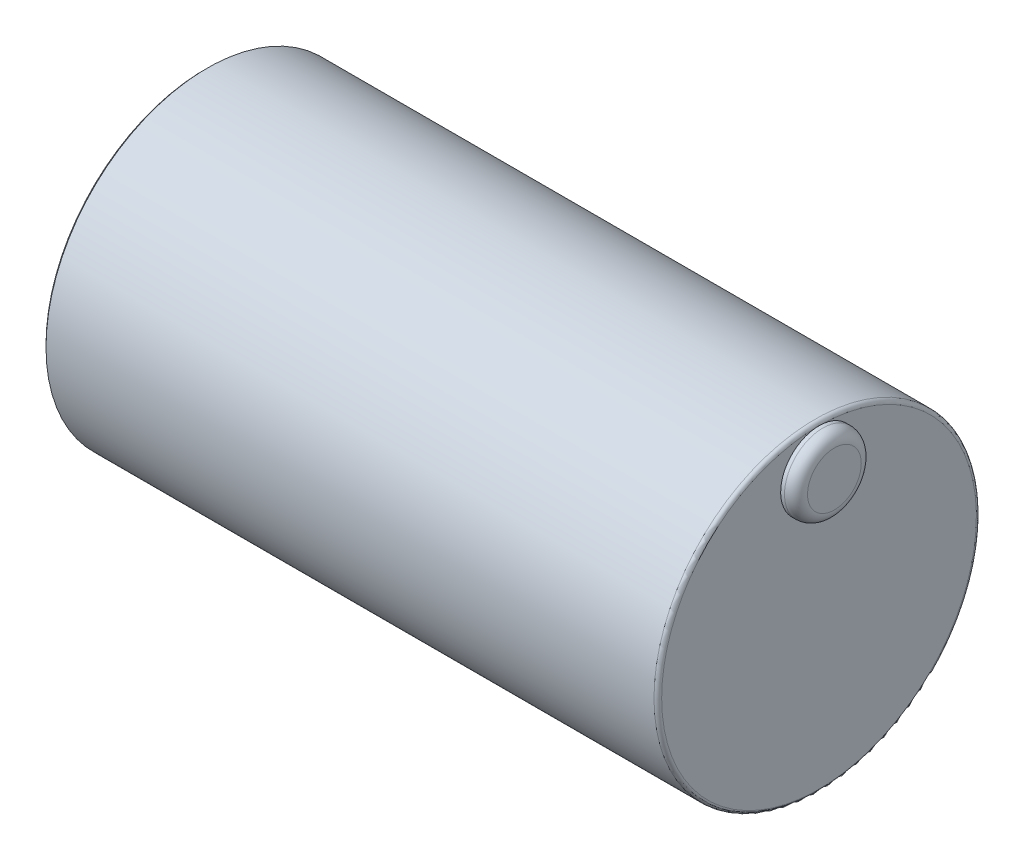
ISO-10303-21;
HEADER;
FILE_DESCRIPTION(('STEP AP214'),'2;1');
FILE_NAME('part.step','',(''),(''),'','','');
FILE_SCHEMA(('AUTOMOTIVE_DESIGN { 1 0 10303 214 1 1 1 1 }'));
ENDSEC;
DATA;
#1=APPLICATION_CONTEXT('core data for automotive mechanical design processes');
#2=APPLICATION_PROTOCOL_DEFINITION('international standard','automotive_design',2000,#1);
#3=PRODUCT_CONTEXT('',#1,'mechanical');
#4=PRODUCT('Part','Part','',(#3));
#5=PRODUCT_RELATED_PRODUCT_CATEGORY('part','',(#4));
#6=PRODUCT_DEFINITION_FORMATION('','',#4);
#7=PRODUCT_DEFINITION_CONTEXT('part definition',#1,'design');
#8=PRODUCT_DEFINITION('design','',#6,#7);
#9=PRODUCT_DEFINITION_SHAPE('','',#8);
#10=(LENGTH_UNIT() NAMED_UNIT(*) SI_UNIT(.MILLI.,.METRE.));
#11=(NAMED_UNIT(*) PLANE_ANGLE_UNIT() SI_UNIT($,.RADIAN.));
#12=(NAMED_UNIT(*) SI_UNIT($,.STERADIAN.) SOLID_ANGLE_UNIT());
#13=UNCERTAINTY_MEASURE_WITH_UNIT(LENGTH_MEASURE(1.E-05),#10,'distance_accuracy_value','');
#14=(GEOMETRIC_REPRESENTATION_CONTEXT(3) GLOBAL_UNCERTAINTY_ASSIGNED_CONTEXT((#13)) GLOBAL_UNIT_ASSIGNED_CONTEXT((#10,
#11,#12)) REPRESENTATION_CONTEXT('',''));
#15=CARTESIAN_POINT('',(0.,0.,0.));
#16=DIRECTION('',(0.,0.,1.));
#17=DIRECTION('',(1.,0.,0.));
#18=AXIS2_PLACEMENT_3D('',#15,#16,#17);
#19=CARTESIAN_POINT('',(0.,0.,0.));
#20=DIRECTION('',(1.,0.,0.));
#21=DIRECTION('',(0.,0.,-1.));
#22=AXIS2_PLACEMENT_3D('',#19,#20,#21);
#23=PLANE('',#22);
#24=CARTESIAN_POINT('',(0.,0.,0.));
#25=DIRECTION('',(1.,0.,0.));
#26=DIRECTION('',(0.,0.,-1.));
#27=AXIS2_PLACEMENT_3D('',#24,#25,#26);
#28=CIRCLE('',#27,10.7);
#29=CARTESIAN_POINT('',(0.,0.,-10.7));
#30=VERTEX_POINT('',#29);
#31=EDGE_CURVE('E116',#30,#30,#28,.F.);
#32=ORIENTED_EDGE('',*,*,#31,.T.);
#33=EDGE_LOOP('',(#32));
#34=FACE_BOUND('',#33,.T.);
#35=ADVANCED_FACE('F40',(#34),#23,.F.);
#36=CARTESIAN_POINT('',(-33.7551020408164,0.,0.));
#37=DIRECTION('',(-1.,0.,0.));
#38=DIRECTION('',(0.,0.,1.));
#39=AXIS2_PLACEMENT_3D('',#36,#37,#38);
#40=CYLINDRICAL_SURFACE('',#39,11.);
#41=CARTESIAN_POINT('',(0.300000000000016,0.,0.));
#42=DIRECTION('',(1.,0.,0.));
#43=DIRECTION('',(0.,0.,-1.));
#44=AXIS2_PLACEMENT_3D('',#41,#42,#43);
#45=CIRCLE('',#44,11.);
#46=CARTESIAN_POINT('',(0.300000000000016,0.,-11.));
#47=VERTEX_POINT('',#46);
#48=EDGE_CURVE('E120',#47,#47,#45,.T.);
#49=ORIENTED_EDGE('',*,*,#48,.T.);
#50=EDGE_LOOP('',(#49));
#51=FACE_BOUND('',#50,.T.);
#52=CARTESIAN_POINT('',(2.,0.,0.));
#53=DIRECTION('',(-1.,0.,0.));
#54=DIRECTION('',(0.,0.,1.));
#55=AXIS2_PLACEMENT_3D('',#52,#53,#54);
#56=CIRCLE('',#55,11.);
#57=CARTESIAN_POINT('',(2.,0.,11.));
#58=VERTEX_POINT('',#57);
#59=EDGE_CURVE('E112',#58,#58,#56,.T.);
#60=ORIENTED_EDGE('',*,*,#59,.T.);
#61=EDGE_LOOP('',(#60));
#62=FACE_BOUND('',#61,.T.);
#63=ADVANCED_FACE('F156',(#51,#62),#40,.T.);
#64=CARTESIAN_POINT('',(2.,11.,0.));
#65=DIRECTION('',(1.,0.,0.));
#66=DIRECTION('',(0.,0.,-1.));
#67=AXIS2_PLACEMENT_3D('',#64,#65,#66);
#68=PLANE('',#67);
#69=CARTESIAN_POINT('',(2.,1.6759110426447E-13,16.));
#70=DIRECTION('',(-1.,0.,0.));
#71=DIRECTION('',(0.,0.,1.));
#72=AXIS2_PLACEMENT_3D('',#69,#70,#71);
#73=CIRCLE('',#72,1.64999999999999);
#74=CARTESIAN_POINT('',(2.,1.6759110426447E-13,17.65));
#75=VERTEX_POINT('',#74);
#76=EDGE_CURVE('E79',#75,#75,#73,.T.);
#77=ORIENTED_EDGE('',*,*,#76,.F.);
#78=EDGE_LOOP('',(#77));
#79=FACE_BOUND('',#78,.T.);
#80=CARTESIAN_POINT('',(2.,-16.,0.));
#81=DIRECTION('',(-1.,0.,0.));
#82=DIRECTION('',(0.,0.,1.));
#83=AXIS2_PLACEMENT_3D('',#80,#81,#82);
#84=CIRCLE('',#83,1.64999999999999);
#85=CARTESIAN_POINT('',(2.,-16.,1.64999999999999));
#86=VERTEX_POINT('',#85);
#87=EDGE_CURVE('E78',#86,#86,#84,.T.);
#88=ORIENTED_EDGE('',*,*,#87,.F.);
#89=EDGE_LOOP('',(#88));
#90=FACE_BOUND('',#89,.T.);
#91=CARTESIAN_POINT('',(2.,0.,-16.));
#92=DIRECTION('',(-1.,0.,0.));
#93=DIRECTION('',(0.,0.,1.));
#94=AXIS2_PLACEMENT_3D('',#91,#92,#93);
#95=CIRCLE('',#94,1.64999999999999);
#96=CARTESIAN_POINT('',(2.,0.,-14.35));
#97=VERTEX_POINT('',#96);
#98=EDGE_CURVE('E92',#97,#97,#95,.T.);
#99=ORIENTED_EDGE('',*,*,#98,.F.);
#100=EDGE_LOOP('',(#99));
#101=FACE_BOUND('',#100,.T.);
#102=CARTESIAN_POINT('',(2.,16.,0.));
#103=DIRECTION('',(-1.,0.,0.));
#104=DIRECTION('',(0.,0.,1.));
#105=AXIS2_PLACEMENT_3D('',#102,#103,#104);
#106=CIRCLE('',#105,1.64999999999999);
#107=CARTESIAN_POINT('',(2.,16.,1.64999999999999));
#108=VERTEX_POINT('',#107);
#109=EDGE_CURVE('E100',#108,#108,#106,.T.);
#110=ORIENTED_EDGE('',*,*,#109,.F.);
#111=EDGE_LOOP('',(#110));
#112=FACE_BOUND('',#111,.T.);
#113=CARTESIAN_POINT('',(2.,0.,0.));
#114=DIRECTION('',(1.,0.,0.));
#115=DIRECTION('',(0.,0.,-1.));
#116=AXIS2_PLACEMENT_3D('',#113,#114,#115);
#117=CIRCLE('',#116,20.7);
#118=CARTESIAN_POINT('',(2.,0.,-20.7));
#119=VERTEX_POINT('',#118);
#120=EDGE_CURVE('E124',#119,#119,#117,.F.);
#121=ORIENTED_EDGE('',*,*,#120,.T.);
#122=EDGE_LOOP('',(#121));
#123=FACE_BOUND('',#122,.T.);
#124=ORIENTED_EDGE('',*,*,#59,.F.);
#125=EDGE_LOOP('',(#124));
#126=FACE_BOUND('',#125,.T.);
#127=ADVANCED_FACE('F162',(#79,#90,#101,#112,#123,#126),#68,.F.);
#128=CARTESIAN_POINT('',(-33.7551020408164,0.,0.));
#129=DIRECTION('',(-1.,0.,0.));
#130=DIRECTION('',(0.,0.,1.));
#131=AXIS2_PLACEMENT_3D('',#128,#129,#130);
#132=CYLINDRICAL_SURFACE('',#131,21.);
#133=CARTESIAN_POINT('',(81.5,0.,0.));
#134=DIRECTION('',(-1.,0.,0.));
#135=DIRECTION('',(0.,0.,1.));
#136=AXIS2_PLACEMENT_3D('',#133,#134,#135);
#137=CIRCLE('',#136,21.);
#138=CARTESIAN_POINT('',(81.5,0.,21.));
#139=VERTEX_POINT('',#138);
#140=EDGE_CURVE('E132',#139,#139,#137,.T.);
#141=ORIENTED_EDGE('',*,*,#140,.T.);
#142=EDGE_LOOP('',(#141));
#143=FACE_BOUND('',#142,.T.);
#144=CARTESIAN_POINT('',(2.3,0.,0.));
#145=DIRECTION('',(1.,0.,0.));
#146=DIRECTION('',(0.,0.,-1.));
#147=AXIS2_PLACEMENT_3D('',#144,#145,#146);
#148=CIRCLE('',#147,21.);
#149=CARTESIAN_POINT('',(2.3,0.,-21.));
#150=VERTEX_POINT('',#149);
#151=EDGE_CURVE('E128',#150,#150,#148,.T.);
#152=ORIENTED_EDGE('',*,*,#151,.T.);
#153=EDGE_LOOP('',(#152));
#154=FACE_BOUND('',#153,.T.);
#155=ADVANCED_FACE('F187',(#143,#154),#132,.T.);
#156=CARTESIAN_POINT('',(82.,21.,0.));
#157=DIRECTION('',(-1.,0.,0.));
#158=DIRECTION('',(0.,0.,1.));
#159=AXIS2_PLACEMENT_3D('',#156,#157,#158);
#160=PLANE('',#159);
#161=CARTESIAN_POINT('',(82.,0.,0.));
#162=DIRECTION('',(-1.,0.,0.));
#163=DIRECTION('',(0.,0.,1.));
#164=AXIS2_PLACEMENT_3D('',#161,#162,#163);
#165=CIRCLE('',#164,20.5);
#166=CARTESIAN_POINT('',(82.,20.5,0.));
#167=VERTEX_POINT('',#166);
#168=EDGE_CURVE('E54',#167,#167,#165,.F.);
#169=ORIENTED_EDGE('',*,*,#168,.T.);
#170=CARTESIAN_POINT('',(82.,15.5,0.));
#171=DIRECTION('',(1.,0.,0.));
#172=DIRECTION('',(0.,0.,-1.));
#173=AXIS2_PLACEMENT_3D('',#170,#171,#172);
#174=CIRCLE('',#173,5.);
#175=EDGE_CURVE('E108',#167,#167,#174,.T.);
#176=ORIENTED_EDGE('',*,*,#175,.F.);
#177=EDGE_LOOP('',(#169,#176));
#178=FACE_BOUND('',#177,.T.);
#179=ADVANCED_FACE('F171',(#178),#160,.F.);
#180=CARTESIAN_POINT('',(0.,0.,0.));
#181=DIRECTION('',(1.,0.,0.));
#182=DIRECTION('',(0.,0.,-1.));
#183=AXIS2_PLACEMENT_3D('',#180,#181,#182);
#184=CONICAL_SURFACE('',#183,10.7,0.785398163397443);
#185=ORIENTED_EDGE('',*,*,#48,.F.);
#186=EDGE_LOOP('',(#185));
#187=FACE_BOUND('',#186,.T.);
#188=ORIENTED_EDGE('',*,*,#31,.F.);
#189=EDGE_LOOP('',(#188));
#190=FACE_BOUND('',#189,.T.);
#191=ADVANCED_FACE('F167',(#187,#190),#184,.T.);
#192=CARTESIAN_POINT('',(2.,0.,0.));
#193=DIRECTION('',(1.,0.,0.));
#194=DIRECTION('',(0.,0.,-1.));
#195=AXIS2_PLACEMENT_3D('',#192,#193,#194);
#196=CONICAL_SURFACE('',#195,20.7,0.785398163397454);
#197=ORIENTED_EDGE('',*,*,#151,.F.);
#198=EDGE_LOOP('',(#197));
#199=FACE_BOUND('',#198,.T.);
#200=ORIENTED_EDGE('',*,*,#120,.F.);
#201=EDGE_LOOP('',(#200));
#202=FACE_BOUND('',#201,.T.);
#203=ADVANCED_FACE('F170',(#199,#202),#196,.T.);
#204=CARTESIAN_POINT('',(81.5,0.,0.));
#205=DIRECTION('',(-1.,0.,0.));
#206=DIRECTION('',(0.,0.,1.));
#207=AXIS2_PLACEMENT_3D('',#204,#205,#206);
#208=TOROIDAL_SURFACE('',#207,20.5,0.5);
#209=ORIENTED_EDGE('',*,*,#168,.F.);
#210=EDGE_LOOP('',(#209));
#211=FACE_BOUND('',#210,.T.);
#212=ORIENTED_EDGE('',*,*,#140,.F.);
#213=EDGE_LOOP('',(#212));
#214=FACE_BOUND('',#213,.T.);
#215=ADVANCED_FACE('F174',(#211,#214),#208,.T.);
#216=CARTESIAN_POINT('',(84.,15.5,0.));
#217=DIRECTION('',(-1.,0.,0.));
#218=DIRECTION('',(0.,0.,1.));
#219=AXIS2_PLACEMENT_3D('',#216,#217,#218);
#220=CYLINDRICAL_SURFACE('',#219,5.);
#221=CARTESIAN_POINT('',(82.5,15.5,0.));
#222=DIRECTION('',(1.,0.,0.));
#223=DIRECTION('',(0.,0.,-1.));
#224=AXIS2_PLACEMENT_3D('',#221,#222,#223);
#225=CIRCLE('',#224,5.);
#226=CARTESIAN_POINT('',(82.5,15.5,-5.00000000000001));
#227=VERTEX_POINT('',#226);
#228=EDGE_CURVE('E11',#227,#227,#225,.F.);
#229=ORIENTED_EDGE('',*,*,#228,.T.);
#230=EDGE_LOOP('',(#229));
#231=FACE_BOUND('',#230,.T.);
#232=ORIENTED_EDGE('',*,*,#175,.T.);
#233=EDGE_LOOP('',(#232));
#234=FACE_BOUND('',#233,.T.);
#235=ADVANCED_FACE('F152',(#231,#234),#220,.T.);
#236=CARTESIAN_POINT('',(84.,15.5,0.));
#237=DIRECTION('',(1.,0.,0.));
#238=DIRECTION('',(0.,0.,-1.));
#239=AXIS2_PLACEMENT_3D('',#236,#237,#238);
#240=PLANE('',#239);
#241=CARTESIAN_POINT('',(84.,15.5,0.));
#242=DIRECTION('',(1.,0.,0.));
#243=DIRECTION('',(0.,0.,-1.));
#244=AXIS2_PLACEMENT_3D('',#241,#242,#243);
#245=CIRCLE('',#244,3.5);
#246=CARTESIAN_POINT('',(84.,15.5,-3.50000000000001));
#247=VERTEX_POINT('',#246);
#248=EDGE_CURVE('E49',#247,#247,#245,.T.);
#249=ORIENTED_EDGE('',*,*,#248,.T.);
#250=EDGE_LOOP('',(#249));
#251=FACE_BOUND('',#250,.T.);
#252=ADVANCED_FACE('F141',(#251),#240,.T.);
#253=CARTESIAN_POINT('',(82.5,15.5,0.));
#254=DIRECTION('',(1.,0.,0.));
#255=DIRECTION('',(0.,0.,-1.));
#256=AXIS2_PLACEMENT_3D('',#253,#254,#255);
#257=TOROIDAL_SURFACE('',#256,3.5,1.5);
#258=ORIENTED_EDGE('',*,*,#228,.F.);
#259=EDGE_LOOP('',(#258));
#260=FACE_BOUND('',#259,.T.);
#261=ORIENTED_EDGE('',*,*,#248,.F.);
#262=EDGE_LOOP('',(#261));
#263=FACE_BOUND('',#262,.T.);
#264=ADVANCED_FACE('F42',(#260,#263),#257,.T.);
#265=CARTESIAN_POINT('',(10.,16.,0.));
#266=DIRECTION('',(-1.,0.,0.));
#267=DIRECTION('',(0.,0.,1.));
#268=AXIS2_PLACEMENT_3D('',#265,#266,#267);
#269=CONICAL_SURFACE('',#268,1.65,1.02974425867665);
#270=CARTESIAN_POINT('',(10.9914200213955,16.,0.));
#271=VERTEX_POINT('',#270);
#272=VERTEX_LOOP('',#271);
#273=FACE_BOUND('',#272,.T.);
#274=CARTESIAN_POINT('',(10.,16.,0.));
#275=DIRECTION('',(-1.,0.,0.));
#276=DIRECTION('',(0.,0.,1.));
#277=AXIS2_PLACEMENT_3D('',#274,#275,#276);
#278=CIRCLE('',#277,1.65);
#279=CARTESIAN_POINT('',(10.,16.,1.65));
#280=VERTEX_POINT('',#279);
#281=EDGE_CURVE('E104',#280,#280,#278,.T.);
#282=ORIENTED_EDGE('',*,*,#281,.T.);
#283=EDGE_LOOP('',(#282));
#284=FACE_BOUND('',#283,.T.);
#285=ADVANCED_FACE('F144',(#273,#284),#269,.F.);
#286=CARTESIAN_POINT('',(2.,16.,0.));
#287=DIRECTION('',(-1.,0.,0.));
#288=DIRECTION('',(0.,0.,1.));
#289=AXIS2_PLACEMENT_3D('',#286,#287,#288);
#290=CYLINDRICAL_SURFACE('',#289,1.65);
#291=ORIENTED_EDGE('',*,*,#281,.F.);
#292=EDGE_LOOP('',(#291));
#293=FACE_BOUND('',#292,.T.);
#294=ORIENTED_EDGE('',*,*,#109,.T.);
#295=EDGE_LOOP('',(#294));
#296=FACE_BOUND('',#295,.T.);
#297=ADVANCED_FACE('F150',(#293,#296),#290,.F.);
#298=CARTESIAN_POINT('',(10.,0.,-16.));
#299=DIRECTION('',(-1.,0.,0.));
#300=DIRECTION('',(0.,0.,1.));
#301=AXIS2_PLACEMENT_3D('',#298,#299,#300);
#302=CONICAL_SURFACE('',#301,1.65,1.02974425867665);
#303=CARTESIAN_POINT('',(10.9914200213955,0.,-16.));
#304=VERTEX_POINT('',#303);
#305=VERTEX_LOOP('',#304);
#306=FACE_BOUND('',#305,.T.);
#307=CARTESIAN_POINT('',(10.,0.,-16.));
#308=DIRECTION('',(-1.,0.,0.));
#309=DIRECTION('',(0.,0.,1.));
#310=AXIS2_PLACEMENT_3D('',#307,#308,#309);
#311=CIRCLE('',#310,1.65);
#312=CARTESIAN_POINT('',(10.,0.,-14.35));
#313=VERTEX_POINT('',#312);
#314=EDGE_CURVE('E96',#313,#313,#311,.T.);
#315=ORIENTED_EDGE('',*,*,#314,.T.);
#316=EDGE_LOOP('',(#315));
#317=FACE_BOUND('',#316,.T.);
#318=ADVANCED_FACE('F211',(#306,#317),#302,.F.);
#319=CARTESIAN_POINT('',(2.,0.,-16.));
#320=DIRECTION('',(-1.,0.,0.));
#321=DIRECTION('',(0.,0.,1.));
#322=AXIS2_PLACEMENT_3D('',#319,#320,#321);
#323=CYLINDRICAL_SURFACE('',#322,1.64999999999999);
#324=ORIENTED_EDGE('',*,*,#314,.F.);
#325=EDGE_LOOP('',(#324));
#326=FACE_BOUND('',#325,.T.);
#327=ORIENTED_EDGE('',*,*,#98,.T.);
#328=EDGE_LOOP('',(#327));
#329=FACE_BOUND('',#328,.T.);
#330=ADVANCED_FACE('F215',(#326,#329),#323,.F.);
#331=CARTESIAN_POINT('',(10.,-16.,0.));
#332=DIRECTION('',(-1.,0.,0.));
#333=DIRECTION('',(0.,0.,1.));
#334=AXIS2_PLACEMENT_3D('',#331,#332,#333);
#335=CONICAL_SURFACE('',#334,1.65,1.02974425867665);
#336=CARTESIAN_POINT('',(10.9914200213955,-16.,0.));
#337=VERTEX_POINT('',#336);
#338=VERTEX_LOOP('',#337);
#339=FACE_BOUND('',#338,.T.);
#340=CARTESIAN_POINT('',(10.,-16.,0.));
#341=DIRECTION('',(-1.,0.,0.));
#342=DIRECTION('',(0.,0.,1.));
#343=AXIS2_PLACEMENT_3D('',#340,#341,#342);
#344=CIRCLE('',#343,1.65);
#345=CARTESIAN_POINT('',(10.,-16.,1.65));
#346=VERTEX_POINT('',#345);
#347=EDGE_CURVE('E84',#346,#346,#344,.T.);
#348=ORIENTED_EDGE('',*,*,#347,.T.);
#349=EDGE_LOOP('',(#348));
#350=FACE_BOUND('',#349,.T.);
#351=ADVANCED_FACE('F219',(#339,#350),#335,.F.);
#352=CARTESIAN_POINT('',(2.,-16.,0.));
#353=DIRECTION('',(-1.,0.,0.));
#354=DIRECTION('',(0.,0.,1.));
#355=AXIS2_PLACEMENT_3D('',#352,#353,#354);
#356=CYLINDRICAL_SURFACE('',#355,1.64999999999999);
#357=ORIENTED_EDGE('',*,*,#347,.F.);
#358=EDGE_LOOP('',(#357));
#359=FACE_BOUND('',#358,.T.);
#360=ORIENTED_EDGE('',*,*,#87,.T.);
#361=EDGE_LOOP('',(#360));
#362=FACE_BOUND('',#361,.T.);
#363=ADVANCED_FACE('F71',(#359,#362),#356,.F.);
#364=CARTESIAN_POINT('',(10.,1.6759110426447E-13,16.));
#365=DIRECTION('',(-1.,0.,0.));
#366=DIRECTION('',(0.,0.,1.));
#367=AXIS2_PLACEMENT_3D('',#364,#365,#366);
#368=CONICAL_SURFACE('',#367,1.65,1.02974425867665);
#369=CARTESIAN_POINT('',(10.9914200213955,1.65388841514672E-13,16.));
#370=VERTEX_POINT('',#369);
#371=VERTEX_LOOP('',#370);
#372=FACE_BOUND('',#371,.T.);
#373=CARTESIAN_POINT('',(10.,1.6759110426447E-13,16.));
#374=DIRECTION('',(-1.,0.,0.));
#375=DIRECTION('',(0.,0.,1.));
#376=AXIS2_PLACEMENT_3D('',#373,#374,#375);
#377=CIRCLE('',#376,1.65);
#378=CARTESIAN_POINT('',(10.,1.6759110426447E-13,17.65));
#379=VERTEX_POINT('',#378);
#380=EDGE_CURVE('E75',#379,#379,#377,.T.);
#381=ORIENTED_EDGE('',*,*,#380,.T.);
#382=EDGE_LOOP('',(#381));
#383=FACE_BOUND('',#382,.T.);
#384=ADVANCED_FACE('F67',(#372,#383),#368,.F.);
#385=CARTESIAN_POINT('',(2.,1.6759110426447E-13,16.));
#386=DIRECTION('',(-1.,0.,0.));
#387=DIRECTION('',(0.,0.,1.));
#388=AXIS2_PLACEMENT_3D('',#385,#386,#387);
#389=CYLINDRICAL_SURFACE('',#388,1.64999999999999);
#390=ORIENTED_EDGE('',*,*,#380,.F.);
#391=EDGE_LOOP('',(#390));
#392=FACE_BOUND('',#391,.T.);
#393=ORIENTED_EDGE('',*,*,#76,.T.);
#394=EDGE_LOOP('',(#393));
#395=FACE_BOUND('',#394,.T.);
#396=ADVANCED_FACE('F70',(#392,#395),#389,.F.);
#397=CLOSED_SHELL('',(#35,#63,#127,#155,#179,#191,#203,#215,#235,#252,#264,#285,#297,#318,#330,
#351,#363,#384,#396));
#398=MANIFOLD_SOLID_BREP('B2',#397);
#399=ADVANCED_BREP_SHAPE_REPRESENTATION('',(#18,#398),#14);
#400=SHAPE_DEFINITION_REPRESENTATION(#9,#399);
ENDSEC;
END-ISO-10303-21;
